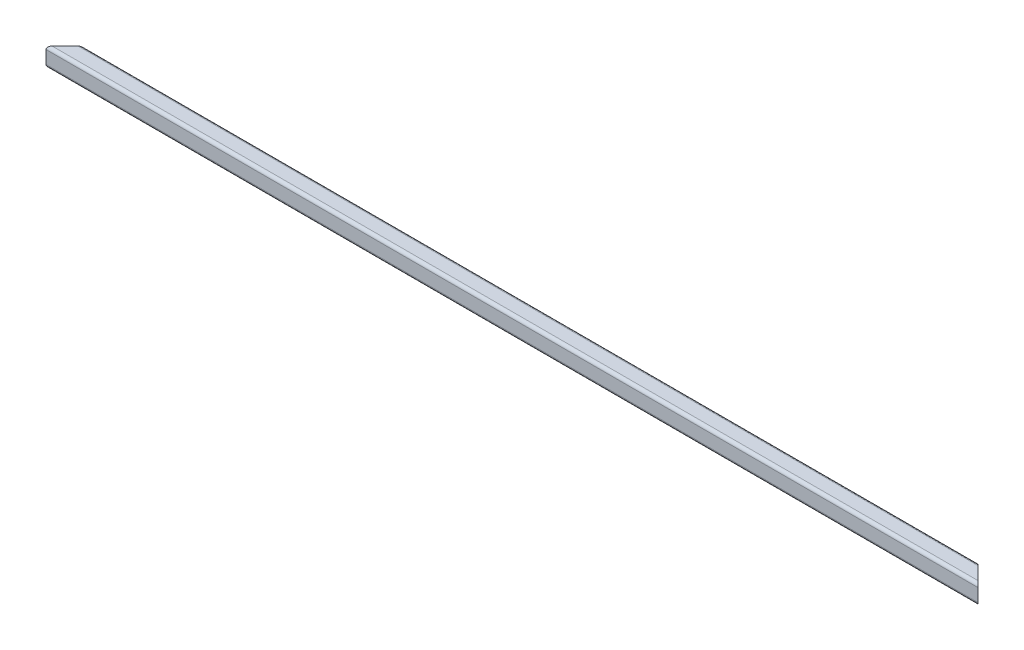
ISO-10303-21;
HEADER;
FILE_DESCRIPTION(('STEP AP214'),'2;1');
FILE_NAME('part.step','',(''),(''),'','','');
FILE_SCHEMA(('AUTOMOTIVE_DESIGN { 1 0 10303 214 1 1 1 1 }'));
ENDSEC;
DATA;
#1=APPLICATION_CONTEXT('core data for automotive mechanical design processes');
#2=APPLICATION_PROTOCOL_DEFINITION('international standard','automotive_design',2000,#1);
#3=PRODUCT_CONTEXT('',#1,'mechanical');
#4=PRODUCT('Part','Part','',(#3));
#5=PRODUCT_RELATED_PRODUCT_CATEGORY('part','',(#4));
#6=PRODUCT_DEFINITION_FORMATION('','',#4);
#7=PRODUCT_DEFINITION_CONTEXT('part definition',#1,'design');
#8=PRODUCT_DEFINITION('design','',#6,#7);
#9=PRODUCT_DEFINITION_SHAPE('','',#8);
#10=(LENGTH_UNIT() NAMED_UNIT(*) SI_UNIT(.MILLI.,.METRE.));
#11=(NAMED_UNIT(*) PLANE_ANGLE_UNIT() SI_UNIT($,.RADIAN.));
#12=(NAMED_UNIT(*) SI_UNIT($,.STERADIAN.) SOLID_ANGLE_UNIT());
#13=UNCERTAINTY_MEASURE_WITH_UNIT(LENGTH_MEASURE(1.E-05),#10,'distance_accuracy_value','');
#14=(GEOMETRIC_REPRESENTATION_CONTEXT(3) GLOBAL_UNCERTAINTY_ASSIGNED_CONTEXT((#13)) GLOBAL_UNIT_ASSIGNED_CONTEXT((#10,
#11,#12)) REPRESENTATION_CONTEXT('',''));
#15=CARTESIAN_POINT('',(0.,0.,0.));
#16=DIRECTION('',(0.,0.,1.));
#17=DIRECTION('',(1.,0.,0.));
#18=AXIS2_PLACEMENT_3D('',#15,#16,#17);
#19=CARTESIAN_POINT('',(1960.,13.6,-20.));
#20=DIRECTION('',(0.,0.,1.));
#21=DIRECTION('',(1.,0.,0.));
#22=AXIS2_PLACEMENT_3D('',#19,#20,#21);
#23=PLANE('',#22);
#24=DIRECTION('',(-1.,0.,0.));
#25=VECTOR('',#24,1.);
#26=CARTESIAN_POINT('',(1960.,-13.6,-20.));
#27=LINE('',#26,#25);
#28=CARTESIAN_POINT('',(1920.,-13.6,-20.0000000000004));
#29=VERTEX_POINT('',#28);
#30=CARTESIAN_POINT('',(40.,-13.6,-20.));
#31=VERTEX_POINT('',#30);
#32=EDGE_CURVE('E339',#29,#31,#27,.T.);
#33=ORIENTED_EDGE('',*,*,#32,.T.);
#34=DIRECTION('',(0.,1.,0.));
#35=VECTOR('',#34,1.);
#36=CARTESIAN_POINT('',(40.,-20.,-20.));
#37=LINE('',#36,#35);
#38=CARTESIAN_POINT('',(40.,13.6,-20.));
#39=VERTEX_POINT('',#38);
#40=EDGE_CURVE('E239',#31,#39,#37,.T.);
#41=ORIENTED_EDGE('',*,*,#40,.T.);
#42=DIRECTION('',(-1.,0.,0.));
#43=VECTOR('',#42,1.);
#44=CARTESIAN_POINT('',(1960.,13.6,-20.));
#45=LINE('',#44,#43);
#46=CARTESIAN_POINT('',(1920.,13.6,-20.0000000000004));
#47=VERTEX_POINT('',#46);
#48=EDGE_CURVE('E335',#47,#39,#45,.T.);
#49=ORIENTED_EDGE('',*,*,#48,.F.);
#50=DIRECTION('',(0.,1.,0.));
#51=VECTOR('',#50,1.);
#52=CARTESIAN_POINT('',(1920.,-20.,-20.0000000000004));
#53=LINE('',#52,#51);
#54=EDGE_CURVE('E236',#29,#47,#53,.T.);
#55=ORIENTED_EDGE('',*,*,#54,.F.);
#56=EDGE_LOOP('',(#33,#41,#49,#55));
#57=FACE_BOUND('',#56,.T.);
#58=ADVANCED_FACE('F69',(#57),#23,.F.);
#59=CARTESIAN_POINT('',(1960.,-13.6,-13.6));
#60=DIRECTION('',(-1.,0.,0.));
#61=DIRECTION('',(0.,0.,1.));
#62=AXIS2_PLACEMENT_3D('',#59,#60,#61);
#63=CYLINDRICAL_SURFACE('',#62,6.4);
#64=DIRECTION('',(-1.,0.,0.));
#65=VECTOR('',#64,1.);
#66=CARTESIAN_POINT('',(1960.,-20.,-13.6));
#67=LINE('',#66,#65);
#68=CARTESIAN_POINT('',(1926.4,-20.,-13.6));
#69=VERTEX_POINT('',#68);
#70=CARTESIAN_POINT('',(33.6000000000001,-20.,-13.6000000000001));
#71=VERTEX_POINT('',#70);
#72=EDGE_CURVE('E344',#69,#71,#67,.T.);
#73=ORIENTED_EDGE('',*,*,#72,.T.);
#74=CARTESIAN_POINT('',(33.6000000000001,-13.6,-13.6));
#75=DIRECTION('',(0.707106781186547,0.,0.707106781186548));
#76=DIRECTION('',(-0.707106781186548,0.,0.707106781186547));
#77=AXIS2_PLACEMENT_3D('',#74,#75,#76);
#78=ELLIPSE('',#77,9.05096679918782,6.4);
#79=EDGE_CURVE('E271',#71,#31,#78,.T.);
#80=ORIENTED_EDGE('',*,*,#79,.T.);
#81=ORIENTED_EDGE('',*,*,#32,.F.);
#82=CARTESIAN_POINT('',(1926.4,-13.6,-13.6));
#83=DIRECTION('',(-0.70710678118655,0.,0.707106781186545));
#84=DIRECTION('',(-0.707106781186545,0.,-0.70710678118655));
#85=AXIS2_PLACEMENT_3D('',#82,#83,#84);
#86=ELLIPSE('',#85,9.05096679918778,6.4);
#87=EDGE_CURVE('E313',#29,#69,#86,.T.);
#88=ORIENTED_EDGE('',*,*,#87,.T.);
#89=EDGE_LOOP('',(#73,#80,#81,#88));
#90=FACE_BOUND('',#89,.T.);
#91=ADVANCED_FACE('F432',(#90),#63,.T.);
#92=CARTESIAN_POINT('',(1960.,-20.,13.6));
#93=DIRECTION('',(0.,1.,0.));
#94=DIRECTION('',(0.,0.,1.));
#95=AXIS2_PLACEMENT_3D('',#92,#93,#94);
#96=PLANE('',#95);
#97=CARTESIAN_POINT('',(1460.,-20.,0.));
#98=DIRECTION('',(0.,1.,0.));
#99=DIRECTION('',(0.,0.,1.));
#100=AXIS2_PLACEMENT_3D('',#97,#98,#99);
#101=CIRCLE('',#100,2.0000000000001);
#102=CARTESIAN_POINT('',(1460.,-20.,2.00000000000009));
#103=VERTEX_POINT('',#102);
#104=EDGE_CURVE('E501',#103,#103,#101,.T.);
#105=ORIENTED_EDGE('',*,*,#104,.T.);
#106=EDGE_LOOP('',(#105));
#107=FACE_BOUND('',#106,.T.);
#108=CARTESIAN_POINT('',(980.,-20.,0.));
#109=DIRECTION('',(0.,1.,0.));
#110=DIRECTION('',(0.,0.,1.));
#111=AXIS2_PLACEMENT_3D('',#108,#109,#110);
#112=CIRCLE('',#111,2.);
#113=CARTESIAN_POINT('',(980.,-20.,1.99999999999998));
#114=VERTEX_POINT('',#113);
#115=EDGE_CURVE('E502',#114,#114,#112,.T.);
#116=ORIENTED_EDGE('',*,*,#115,.T.);
#117=EDGE_LOOP('',(#116));
#118=FACE_BOUND('',#117,.T.);
#119=CARTESIAN_POINT('',(500.,-20.,0.));
#120=DIRECTION('',(0.,1.,0.));
#121=DIRECTION('',(0.,0.,1.));
#122=AXIS2_PLACEMENT_3D('',#119,#120,#121);
#123=CIRCLE('',#122,2.);
#124=CARTESIAN_POINT('',(500.,-20.,1.99999999999998));
#125=VERTEX_POINT('',#124);
#126=EDGE_CURVE('E401',#125,#125,#123,.T.);
#127=ORIENTED_EDGE('',*,*,#126,.T.);
#128=EDGE_LOOP('',(#127));
#129=FACE_BOUND('',#128,.T.);
#130=DIRECTION('',(0.707106781186548,0.,-0.707106781186547));
#131=VECTOR('',#130,1.);
#132=CARTESIAN_POINT('',(40.,-20.,-20.));
#133=LINE('',#132,#131);
#134=CARTESIAN_POINT('',(6.39999999999995,-20.,13.6000000000001));
#135=VERTEX_POINT('',#134);
#136=CARTESIAN_POINT('',(18.5857864376269,-20.,1.41421356237308));
#137=VERTEX_POINT('',#136);
#138=EDGE_CURVE('E420',#135,#137,#133,.T.);
#139=ORIENTED_EDGE('',*,*,#138,.T.);
#140=CARTESIAN_POINT('',(20.,-20.,0.));
#141=DIRECTION('',(0.,1.,0.));
#142=DIRECTION('',(0.,0.,1.));
#143=AXIS2_PLACEMENT_3D('',#140,#141,#142);
#144=CIRCLE('',#143,2.);
#145=CARTESIAN_POINT('',(21.4142135623731,-20.,-1.41421356237311));
#146=VERTEX_POINT('',#145);
#147=EDGE_CURVE('E225',#137,#146,#144,.T.);
#148=ORIENTED_EDGE('',*,*,#147,.T.);
#149=EDGE_CURVE('E422',#146,#71,#133,.T.);
#150=ORIENTED_EDGE('',*,*,#149,.T.);
#151=ORIENTED_EDGE('',*,*,#72,.F.);
#152=DIRECTION('',(0.707106781186545,0.,0.70710678118655));
#153=VECTOR('',#152,1.);
#154=CARTESIAN_POINT('',(1920.,-20.,-20.0000000000004));
#155=LINE('',#154,#153);
#156=CARTESIAN_POINT('',(1938.58578643763,-20.,-1.41421356237316));
#157=VERTEX_POINT('',#156);
#158=EDGE_CURVE('E223',#69,#157,#155,.T.);
#159=ORIENTED_EDGE('',*,*,#158,.T.);
#160=CARTESIAN_POINT('',(1940.,-20.,0.));
#161=DIRECTION('',(0.,1.,0.));
#162=DIRECTION('',(0.,0.,1.));
#163=AXIS2_PLACEMENT_3D('',#160,#161,#162);
#164=CIRCLE('',#163,2.0000000000001);
#165=CARTESIAN_POINT('',(1941.41421356237,-20.,1.41421356237319));
#166=VERTEX_POINT('',#165);
#167=EDGE_CURVE('E209',#157,#166,#164,.T.);
#168=ORIENTED_EDGE('',*,*,#167,.T.);
#169=CARTESIAN_POINT('',(1953.6,-20.,13.6));
#170=VERTEX_POINT('',#169);
#171=EDGE_CURVE('E220',#166,#170,#155,.T.);
#172=ORIENTED_EDGE('',*,*,#171,.T.);
#173=DIRECTION('',(-1.,0.,0.));
#174=VECTOR('',#173,1.);
#175=CARTESIAN_POINT('',(1960.,-20.,13.6));
#176=LINE('',#175,#174);
#177=EDGE_CURVE('E348',#170,#135,#176,.T.);
#178=ORIENTED_EDGE('',*,*,#177,.T.);
#179=EDGE_LOOP('',(#139,#148,#150,#151,#159,#168,#172,#178));
#180=FACE_BOUND('',#179,.T.);
#181=ADVANCED_FACE('F218',(#107,#118,#129,#180),#96,.F.);
#182=CARTESIAN_POINT('',(1960.,-13.6,20.));
#183=DIRECTION('',(0.,0.,-1.));
#184=DIRECTION('',(0.,1.,0.));
#185=AXIS2_PLACEMENT_3D('',#182,#183,#184);
#186=PLANE('',#185);
#187=DIRECTION('',(0.,-1.,0.));
#188=VECTOR('',#187,1.);
#189=CARTESIAN_POINT('',(0.,-13.6,20.));
#190=LINE('',#189,#188);
#191=CARTESIAN_POINT('',(0.,13.6,20.));
#192=VERTEX_POINT('',#191);
#193=CARTESIAN_POINT('',(0.,-13.6,20.));
#194=VERTEX_POINT('',#193);
#195=EDGE_CURVE('E327',#192,#194,#190,.T.);
#196=ORIENTED_EDGE('',*,*,#195,.T.);
#197=DIRECTION('',(-1.,0.,0.));
#198=VECTOR('',#197,1.);
#199=CARTESIAN_POINT('',(1960.,-13.6,20.));
#200=LINE('',#199,#198);
#201=CARTESIAN_POINT('',(1960.,-13.6,20.));
#202=VERTEX_POINT('',#201);
#203=EDGE_CURVE('E351',#202,#194,#200,.T.);
#204=ORIENTED_EDGE('',*,*,#203,.F.);
#205=DIRECTION('',(0.,-1.,0.));
#206=VECTOR('',#205,1.);
#207=CARTESIAN_POINT('',(1960.,-13.6,20.));
#208=LINE('',#207,#206);
#209=CARTESIAN_POINT('',(1960.,13.6,20.));
#210=VERTEX_POINT('',#209);
#211=EDGE_CURVE('E328',#210,#202,#208,.T.);
#212=ORIENTED_EDGE('',*,*,#211,.F.);
#213=DIRECTION('',(-1.,0.,0.));
#214=VECTOR('',#213,1.);
#215=CARTESIAN_POINT('',(1960.,13.6,20.));
#216=LINE('',#215,#214);
#217=EDGE_CURVE('E355',#210,#192,#216,.T.);
#218=ORIENTED_EDGE('',*,*,#217,.T.);
#219=EDGE_LOOP('',(#196,#204,#212,#218));
#220=FACE_BOUND('',#219,.T.);
#221=ADVANCED_FACE('F451',(#220),#186,.F.);
#222=CARTESIAN_POINT('',(1960.,-13.6,13.6));
#223=DIRECTION('',(-1.,0.,0.));
#224=DIRECTION('',(0.,0.,1.));
#225=AXIS2_PLACEMENT_3D('',#222,#223,#224);
#226=CYLINDRICAL_SURFACE('',#225,6.4);
#227=ORIENTED_EDGE('',*,*,#203,.T.);
#228=CARTESIAN_POINT('',(6.39999999999996,-13.6,13.6));
#229=DIRECTION('',(0.707106781186547,0.,0.707106781186548));
#230=DIRECTION('',(-0.707106781186548,0.,0.707106781186547));
#231=AXIS2_PLACEMENT_3D('',#228,#229,#230);
#232=ELLIPSE('',#231,9.05096679918781,6.4);
#233=EDGE_CURVE('E275',#194,#135,#232,.T.);
#234=ORIENTED_EDGE('',*,*,#233,.T.);
#235=ORIENTED_EDGE('',*,*,#177,.F.);
#236=CARTESIAN_POINT('',(1953.6,-13.6,13.6));
#237=DIRECTION('',(-0.70710678118655,0.,0.707106781186545));
#238=DIRECTION('',(-0.707106781186545,0.,-0.70710678118655));
#239=AXIS2_PLACEMENT_3D('',#236,#237,#238);
#240=ELLIPSE('',#239,9.05096679918777,6.4);
#241=EDGE_CURVE('E229',#170,#202,#240,.T.);
#242=ORIENTED_EDGE('',*,*,#241,.T.);
#243=EDGE_LOOP('',(#227,#234,#235,#242));
#244=FACE_BOUND('',#243,.T.);
#245=ADVANCED_FACE('F450',(#244),#226,.T.);
#246=CARTESIAN_POINT('',(1960.,13.6,13.6));
#247=DIRECTION('',(-1.,0.,0.));
#248=DIRECTION('',(0.,0.,1.));
#249=AXIS2_PLACEMENT_3D('',#246,#247,#248);
#250=CYLINDRICAL_SURFACE('',#249,6.4);
#251=DIRECTION('',(-1.,0.,0.));
#252=VECTOR('',#251,1.);
#253=CARTESIAN_POINT('',(1960.,20.,13.6));
#254=LINE('',#253,#252);
#255=CARTESIAN_POINT('',(1953.6,20.,13.6));
#256=VERTEX_POINT('',#255);
#257=CARTESIAN_POINT('',(6.39999999999998,20.,13.6));
#258=VERTEX_POINT('',#257);
#259=EDGE_CURVE('E359',#256,#258,#254,.T.);
#260=ORIENTED_EDGE('',*,*,#259,.T.);
#261=CARTESIAN_POINT('',(6.39999999999996,13.6,13.6));
#262=DIRECTION('',(0.707106781186547,0.,0.707106781186548));
#263=DIRECTION('',(-0.707106781186548,0.,0.707106781186547));
#264=AXIS2_PLACEMENT_3D('',#261,#262,#263);
#265=ELLIPSE('',#264,9.05096679918782,6.4);
#266=EDGE_CURVE('E279',#258,#192,#265,.T.);
#267=ORIENTED_EDGE('',*,*,#266,.T.);
#268=ORIENTED_EDGE('',*,*,#217,.F.);
#269=CARTESIAN_POINT('',(1953.6,13.6,13.6));
#270=DIRECTION('',(-0.70710678118655,0.,0.707106781186545));
#271=DIRECTION('',(-0.707106781186545,0.,-0.70710678118655));
#272=AXIS2_PLACEMENT_3D('',#269,#270,#271);
#273=ELLIPSE('',#272,9.05096679918778,6.4);
#274=EDGE_CURVE('E319',#210,#256,#273,.T.);
#275=ORIENTED_EDGE('',*,*,#274,.T.);
#276=EDGE_LOOP('',(#260,#267,#268,#275));
#277=FACE_BOUND('',#276,.T.);
#278=ADVANCED_FACE('F444',(#277),#250,.T.);
#279=CARTESIAN_POINT('',(1960.,20.,-13.6));
#280=DIRECTION('',(0.,-1.,0.));
#281=DIRECTION('',(0.,0.,-1.));
#282=AXIS2_PLACEMENT_3D('',#279,#280,#281);
#283=PLANE('',#282);
#284=DIRECTION('',(-1.,0.,0.));
#285=VECTOR('',#284,1.);
#286=CARTESIAN_POINT('',(1960.,20.,-13.6));
#287=LINE('',#286,#285);
#288=CARTESIAN_POINT('',(1926.4,20.,-13.6));
#289=VERTEX_POINT('',#288);
#290=CARTESIAN_POINT('',(33.5999999999999,20.,-13.5999999999998));
#291=VERTEX_POINT('',#290);
#292=EDGE_CURVE('E363',#289,#291,#287,.T.);
#293=ORIENTED_EDGE('',*,*,#292,.T.);
#294=DIRECTION('',(0.707106781186548,0.,-0.707106781186547));
#295=VECTOR('',#294,1.);
#296=CARTESIAN_POINT('',(40.,20.,-20.));
#297=LINE('',#296,#295);
#298=EDGE_CURVE('E244',#258,#291,#297,.T.);
#299=ORIENTED_EDGE('',*,*,#298,.F.);
#300=ORIENTED_EDGE('',*,*,#259,.F.);
#301=DIRECTION('',(0.707106781186545,0.,0.70710678118655));
#302=VECTOR('',#301,1.);
#303=CARTESIAN_POINT('',(1920.,20.,-20.0000000000004));
#304=LINE('',#303,#302);
#305=EDGE_CURVE('E232',#289,#256,#304,.T.);
#306=ORIENTED_EDGE('',*,*,#305,.F.);
#307=EDGE_LOOP('',(#293,#299,#300,#306));
#308=FACE_BOUND('',#307,.T.);
#309=ADVANCED_FACE('F442',(#308),#283,.F.);
#310=CARTESIAN_POINT('',(1960.,13.6,-13.6));
#311=DIRECTION('',(-1.,0.,0.));
#312=DIRECTION('',(0.,0.,1.));
#313=AXIS2_PLACEMENT_3D('',#310,#311,#312);
#314=CYLINDRICAL_SURFACE('',#313,6.4);
#315=ORIENTED_EDGE('',*,*,#48,.T.);
#316=CARTESIAN_POINT('',(33.6000000000001,13.6,-13.6));
#317=DIRECTION('',(0.707106781186547,0.,0.707106781186548));
#318=DIRECTION('',(-0.707106781186548,0.,0.707106781186547));
#319=AXIS2_PLACEMENT_3D('',#316,#317,#318);
#320=ELLIPSE('',#319,9.05096679918782,6.4);
#321=EDGE_CURVE('E283',#39,#291,#320,.T.);
#322=ORIENTED_EDGE('',*,*,#321,.T.);
#323=ORIENTED_EDGE('',*,*,#292,.F.);
#324=CARTESIAN_POINT('',(1926.4,13.6,-13.6));
#325=DIRECTION('',(-0.70710678118655,0.,0.707106781186545));
#326=DIRECTION('',(-0.707106781186545,0.,-0.70710678118655));
#327=AXIS2_PLACEMENT_3D('',#324,#325,#326);
#328=ELLIPSE('',#327,9.05096679918778,6.4);
#329=EDGE_CURVE('E323',#289,#47,#328,.T.);
#330=ORIENTED_EDGE('',*,*,#329,.T.);
#331=EDGE_LOOP('',(#315,#322,#323,#330));
#332=FACE_BOUND('',#331,.T.);
#333=ADVANCED_FACE('F437',(#332),#314,.T.);
#334=CARTESIAN_POINT('',(40.,-20.,-20.));
#335=DIRECTION('',(0.707106781186547,0.,0.707106781186548));
#336=DIRECTION('',(0.707106781186548,0.,-0.707106781186547));
#337=AXIS2_PLACEMENT_3D('',#334,#335,#336);
#338=PLANE('',#337);
#339=ORIENTED_EDGE('',*,*,#149,.F.);
#340=DIRECTION('',(0.,1.,0.));
#341=VECTOR('',#340,1.);
#342=CARTESIAN_POINT('',(21.4142135623731,-20.,-1.41421356237311));
#343=LINE('',#342,#341);
#344=CARTESIAN_POINT('',(21.4142135623729,-16.8,-1.41421356237334));
#345=VERTEX_POINT('',#344);
#346=EDGE_CURVE('E406',#146,#345,#343,.T.);
#347=ORIENTED_EDGE('',*,*,#346,.T.);
#348=DIRECTION('',(0.707106781186548,0.,-0.707106781186547));
#349=VECTOR('',#348,1.);
#350=CARTESIAN_POINT('',(983.2,-16.8000000000001,-963.2));
#351=LINE('',#350,#349);
#352=CARTESIAN_POINT('',(33.5999999999995,-16.8,-13.5999999999998));
#353=VERTEX_POINT('',#352);
#354=EDGE_CURVE('E251',#345,#353,#351,.T.);
#355=ORIENTED_EDGE('',*,*,#354,.T.);
#356=CARTESIAN_POINT('',(33.6000000000001,-13.6,-13.6));
#357=DIRECTION('',(0.707106781186547,0.,0.707106781186548));
#358=DIRECTION('',(-0.707106781186548,0.,0.707106781186547));
#359=AXIS2_PLACEMENT_3D('',#356,#357,#358);
#360=ELLIPSE('',#359,4.5254833995939,3.2);
#361=CARTESIAN_POINT('',(36.8000000000002,-13.6,-16.8));
#362=VERTEX_POINT('',#361);
#363=EDGE_CURVE('E256',#353,#362,#360,.T.);
#364=ORIENTED_EDGE('',*,*,#363,.T.);
#365=DIRECTION('',(0.,1.,0.));
#366=VECTOR('',#365,1.);
#367=CARTESIAN_POINT('',(36.8000000000002,13.6000000000002,-16.8));
#368=LINE('',#367,#366);
#369=CARTESIAN_POINT('',(36.8000000000002,13.6,-16.8));
#370=VERTEX_POINT('',#369);
#371=EDGE_CURVE('E259',#362,#370,#368,.T.);
#372=ORIENTED_EDGE('',*,*,#371,.T.);
#373=CARTESIAN_POINT('',(33.6000000000001,13.6,-13.6));
#374=DIRECTION('',(0.707106781186547,0.,0.707106781186548));
#375=DIRECTION('',(-0.707106781186548,0.,0.707106781186547));
#376=AXIS2_PLACEMENT_3D('',#373,#374,#375);
#377=ELLIPSE('',#376,4.5254833995939,3.2);
#378=CARTESIAN_POINT('',(33.6000000000001,16.8,-13.6));
#379=VERTEX_POINT('',#378);
#380=EDGE_CURVE('E262',#370,#379,#377,.T.);
#381=ORIENTED_EDGE('',*,*,#380,.T.);
#382=DIRECTION('',(-0.707106781186548,0.,0.707106781186547));
#383=VECTOR('',#382,1.);
#384=CARTESIAN_POINT('',(996.8,16.8000000000001,-976.8));
#385=LINE('',#384,#383);
#386=CARTESIAN_POINT('',(6.39999999999963,16.8,13.5999999999999));
#387=VERTEX_POINT('',#386);
#388=EDGE_CURVE('E265',#379,#387,#385,.T.);
#389=ORIENTED_EDGE('',*,*,#388,.T.);
#390=CARTESIAN_POINT('',(6.39999999999996,13.6,13.6));
#391=DIRECTION('',(0.707106781186547,0.,0.707106781186548));
#392=DIRECTION('',(-0.707106781186548,0.,0.707106781186547));
#393=AXIS2_PLACEMENT_3D('',#390,#391,#392);
#394=ELLIPSE('',#393,4.52548339959391,3.2);
#395=CARTESIAN_POINT('',(3.20000000000009,13.6,16.8));
#396=VERTEX_POINT('',#395);
#397=EDGE_CURVE('E268',#387,#396,#394,.T.);
#398=ORIENTED_EDGE('',*,*,#397,.T.);
#399=DIRECTION('',(0.,-1.,0.));
#400=VECTOR('',#399,1.);
#401=CARTESIAN_POINT('',(3.20000000000009,-13.6000000000003,16.8));
#402=LINE('',#401,#400);
#403=CARTESIAN_POINT('',(3.20000000000009,-13.6,16.8));
#404=VERTEX_POINT('',#403);
#405=EDGE_CURVE('E245',#396,#404,#402,.T.);
#406=ORIENTED_EDGE('',*,*,#405,.T.);
#407=CARTESIAN_POINT('',(6.39999999999996,-13.6,13.6));
#408=DIRECTION('',(0.707106781186547,0.,0.707106781186548));
#409=DIRECTION('',(-0.707106781186548,0.,0.707106781186547));
#410=AXIS2_PLACEMENT_3D('',#407,#408,#409);
#411=ELLIPSE('',#410,4.5254833995939,3.2);
#412=CARTESIAN_POINT('',(6.39999999999996,-16.8,13.6));
#413=VERTEX_POINT('',#412);
#414=EDGE_CURVE('E248',#404,#413,#411,.T.);
#415=ORIENTED_EDGE('',*,*,#414,.T.);
#416=CARTESIAN_POINT('',(18.5857864376267,-16.8,1.41421356237285));
#417=VERTEX_POINT('',#416);
#418=EDGE_CURVE('E252',#413,#417,#351,.T.);
#419=ORIENTED_EDGE('',*,*,#418,.T.);
#420=DIRECTION('',(0.,1.,0.));
#421=VECTOR('',#420,1.);
#422=CARTESIAN_POINT('',(18.5857864376269,-20.,1.41421356237308));
#423=LINE('',#422,#421);
#424=EDGE_CURVE('E94',#417,#137,#423,.F.);
#425=ORIENTED_EDGE('',*,*,#424,.T.);
#426=ORIENTED_EDGE('',*,*,#138,.F.);
#427=ORIENTED_EDGE('',*,*,#233,.F.);
#428=ORIENTED_EDGE('',*,*,#195,.F.);
#429=ORIENTED_EDGE('',*,*,#266,.F.);
#430=ORIENTED_EDGE('',*,*,#298,.T.);
#431=ORIENTED_EDGE('',*,*,#321,.F.);
#432=ORIENTED_EDGE('',*,*,#40,.F.);
#433=ORIENTED_EDGE('',*,*,#79,.F.);
#434=EDGE_LOOP('',(#339,#347,#355,#364,#372,#381,#389,#398,#406,#415,#419,#425,#426,#427,#428,
#429,#430,#431,#432,#433));
#435=FACE_BOUND('',#434,.T.);
#436=ADVANCED_FACE('F428',(#435),#338,.F.);
#437=CARTESIAN_POINT('',(1920.,-20.,-20.0000000000004));
#438=DIRECTION('',(-0.70710678118655,0.,0.707106781186545));
#439=DIRECTION('',(0.707106781186545,0.,0.70710678118655));
#440=AXIS2_PLACEMENT_3D('',#437,#438,#439);
#441=PLANE('',#440);
#442=ORIENTED_EDGE('',*,*,#171,.F.);
#443=DIRECTION('',(0.,1.,0.));
#444=VECTOR('',#443,1.);
#445=CARTESIAN_POINT('',(1941.41421356237,-20.,1.41421356237319));
#446=LINE('',#445,#444);
#447=CARTESIAN_POINT('',(1941.41421356237,-16.8,1.41421356237324));
#448=VERTEX_POINT('',#447);
#449=EDGE_CURVE('E206',#166,#448,#446,.T.);
#450=ORIENTED_EDGE('',*,*,#449,.T.);
#451=DIRECTION('',(0.707106781186545,0.,0.70710678118655));
#452=VECTOR('',#451,1.);
#453=CARTESIAN_POINT('',(1956.8,-16.8,16.8));
#454=LINE('',#453,#452);
#455=CARTESIAN_POINT('',(1953.6,-16.8,13.6));
#456=VERTEX_POINT('',#455);
#457=EDGE_CURVE('E293',#448,#456,#454,.T.);
#458=ORIENTED_EDGE('',*,*,#457,.T.);
#459=CARTESIAN_POINT('',(1953.6,-13.6,13.6));
#460=DIRECTION('',(-0.70710678118655,0.,0.707106781186545));
#461=DIRECTION('',(-0.707106781186545,0.,-0.70710678118655));
#462=AXIS2_PLACEMENT_3D('',#459,#460,#461);
#463=ELLIPSE('',#462,4.52548339959388,3.2);
#464=CARTESIAN_POINT('',(1956.8,-13.6,16.8));
#465=VERTEX_POINT('',#464);
#466=EDGE_CURVE('E290',#456,#465,#463,.T.);
#467=ORIENTED_EDGE('',*,*,#466,.T.);
#468=DIRECTION('',(0.,1.,0.));
#469=VECTOR('',#468,1.);
#470=CARTESIAN_POINT('',(1956.8,-13.6,16.8));
#471=LINE('',#470,#469);
#472=CARTESIAN_POINT('',(1956.8,13.6,16.8));
#473=VERTEX_POINT('',#472);
#474=EDGE_CURVE('E287',#465,#473,#471,.T.);
#475=ORIENTED_EDGE('',*,*,#474,.T.);
#476=CARTESIAN_POINT('',(1953.6,13.6,13.6));
#477=DIRECTION('',(-0.70710678118655,0.,0.707106781186545));
#478=DIRECTION('',(-0.707106781186545,0.,-0.70710678118655));
#479=AXIS2_PLACEMENT_3D('',#476,#477,#478);
#480=ELLIPSE('',#479,4.52548339959389,3.2);
#481=CARTESIAN_POINT('',(1953.6,16.8,13.6));
#482=VERTEX_POINT('',#481);
#483=EDGE_CURVE('E310',#473,#482,#480,.T.);
#484=ORIENTED_EDGE('',*,*,#483,.T.);
#485=DIRECTION('',(-0.707106781186545,0.,-0.70710678118655));
#486=VECTOR('',#485,1.);
#487=CARTESIAN_POINT('',(1943.2,16.8,3.19999999999987));
#488=LINE('',#487,#486);
#489=CARTESIAN_POINT('',(1926.4,16.8,-13.6));
#490=VERTEX_POINT('',#489);
#491=EDGE_CURVE('E307',#482,#490,#488,.T.);
#492=ORIENTED_EDGE('',*,*,#491,.T.);
#493=CARTESIAN_POINT('',(1926.4,13.6,-13.6));
#494=DIRECTION('',(-0.70710678118655,0.,0.707106781186545));
#495=DIRECTION('',(-0.707106781186545,0.,-0.70710678118655));
#496=AXIS2_PLACEMENT_3D('',#493,#494,#495);
#497=ELLIPSE('',#496,4.52548339959389,3.2);
#498=CARTESIAN_POINT('',(1923.2,13.6,-16.8));
#499=VERTEX_POINT('',#498);
#500=EDGE_CURVE('E304',#490,#499,#497,.T.);
#501=ORIENTED_EDGE('',*,*,#500,.T.);
#502=DIRECTION('',(0.,-1.,0.));
#503=VECTOR('',#502,1.);
#504=CARTESIAN_POINT('',(1923.2,13.6,-16.8));
#505=LINE('',#504,#503);
#506=CARTESIAN_POINT('',(1923.2,-13.6,-16.8));
#507=VERTEX_POINT('',#506);
#508=EDGE_CURVE('E301',#499,#507,#505,.T.);
#509=ORIENTED_EDGE('',*,*,#508,.T.);
#510=CARTESIAN_POINT('',(1926.4,-13.6,-13.6));
#511=DIRECTION('',(-0.70710678118655,0.,0.707106781186545));
#512=DIRECTION('',(-0.707106781186545,0.,-0.70710678118655));
#513=AXIS2_PLACEMENT_3D('',#510,#511,#512);
#514=ELLIPSE('',#513,4.52548339959389,3.2);
#515=CARTESIAN_POINT('',(1926.4,-16.8,-13.6));
#516=VERTEX_POINT('',#515);
#517=EDGE_CURVE('E298',#507,#516,#514,.T.);
#518=ORIENTED_EDGE('',*,*,#517,.T.);
#519=CARTESIAN_POINT('',(1938.58578643763,-16.8,-1.41421356237311));
#520=VERTEX_POINT('',#519);
#521=EDGE_CURVE('E294',#516,#520,#454,.T.);
#522=ORIENTED_EDGE('',*,*,#521,.T.);
#523=DIRECTION('',(0.,1.,0.));
#524=VECTOR('',#523,1.);
#525=CARTESIAN_POINT('',(1938.58578643763,-20.,-1.41421356237316));
#526=LINE('',#525,#524);
#527=EDGE_CURVE('E87',#520,#157,#526,.F.);
#528=ORIENTED_EDGE('',*,*,#527,.T.);
#529=ORIENTED_EDGE('',*,*,#158,.F.);
#530=ORIENTED_EDGE('',*,*,#87,.F.);
#531=ORIENTED_EDGE('',*,*,#54,.T.);
#532=ORIENTED_EDGE('',*,*,#329,.F.);
#533=ORIENTED_EDGE('',*,*,#305,.T.);
#534=ORIENTED_EDGE('',*,*,#274,.F.);
#535=ORIENTED_EDGE('',*,*,#211,.T.);
#536=ORIENTED_EDGE('',*,*,#241,.F.);
#537=EDGE_LOOP('',(#442,#450,#458,#467,#475,#484,#492,#501,#509,#518,#522,#528,#529,#530,#531,
#532,#533,#534,#535,#536));
#538=FACE_BOUND('',#537,.T.);
#539=ADVANCED_FACE('F227',(#538),#441,.F.);
#540=CARTESIAN_POINT('',(1960.,13.6,13.6));
#541=DIRECTION('',(-1.,0.,0.));
#542=DIRECTION('',(0.,0.,1.));
#543=AXIS2_PLACEMENT_3D('',#540,#541,#542);
#544=CYLINDRICAL_SURFACE('',#543,3.2);
#545=ORIENTED_EDGE('',*,*,#397,.F.);
#546=DIRECTION('',(-1.,0.,0.));
#547=VECTOR('',#546,1.);
#548=CARTESIAN_POINT('',(1960.,16.8,13.6));
#549=LINE('',#548,#547);
#550=EDGE_CURVE('E340',#482,#387,#549,.T.);
#551=ORIENTED_EDGE('',*,*,#550,.F.);
#552=ORIENTED_EDGE('',*,*,#483,.F.);
#553=DIRECTION('',(-1.,0.,0.));
#554=VECTOR('',#553,1.);
#555=CARTESIAN_POINT('',(1960.,13.6,16.8));
#556=LINE('',#555,#554);
#557=EDGE_CURVE('E331',#473,#396,#556,.T.);
#558=ORIENTED_EDGE('',*,*,#557,.T.);
#559=EDGE_LOOP('',(#545,#551,#552,#558));
#560=FACE_BOUND('',#559,.T.);
#561=ADVANCED_FACE('F71',(#560),#544,.F.);
#562=CARTESIAN_POINT('',(1960.,16.8,-13.6));
#563=DIRECTION('',(0.,-1.,0.));
#564=DIRECTION('',(0.,0.,-1.));
#565=AXIS2_PLACEMENT_3D('',#562,#563,#564);
#566=PLANE('',#565);
#567=ORIENTED_EDGE('',*,*,#388,.F.);
#568=DIRECTION('',(-1.,0.,0.));
#569=VECTOR('',#568,1.);
#570=CARTESIAN_POINT('',(1960.,16.8,-13.6));
#571=LINE('',#570,#569);
#572=EDGE_CURVE('E390',#490,#379,#571,.T.);
#573=ORIENTED_EDGE('',*,*,#572,.F.);
#574=ORIENTED_EDGE('',*,*,#491,.F.);
#575=ORIENTED_EDGE('',*,*,#550,.T.);
#576=EDGE_LOOP('',(#567,#573,#574,#575));
#577=FACE_BOUND('',#576,.T.);
#578=ADVANCED_FACE('F476',(#577),#566,.T.);
#579=CARTESIAN_POINT('',(1960.,13.6,-13.6));
#580=DIRECTION('',(-1.,0.,0.));
#581=DIRECTION('',(0.,0.,1.));
#582=AXIS2_PLACEMENT_3D('',#579,#580,#581);
#583=CYLINDRICAL_SURFACE('',#582,3.2);
#584=ORIENTED_EDGE('',*,*,#380,.F.);
#585=DIRECTION('',(-1.,0.,0.));
#586=VECTOR('',#585,1.);
#587=CARTESIAN_POINT('',(1960.,13.6,-16.8));
#588=LINE('',#587,#586);
#589=EDGE_CURVE('E386',#499,#370,#588,.T.);
#590=ORIENTED_EDGE('',*,*,#589,.F.);
#591=ORIENTED_EDGE('',*,*,#500,.F.);
#592=ORIENTED_EDGE('',*,*,#572,.T.);
#593=EDGE_LOOP('',(#584,#590,#591,#592));
#594=FACE_BOUND('',#593,.T.);
#595=ADVANCED_FACE('F479',(#594),#583,.F.);
#596=CARTESIAN_POINT('',(1960.,13.6,-16.8));
#597=DIRECTION('',(0.,0.,1.));
#598=DIRECTION('',(1.,0.,0.));
#599=AXIS2_PLACEMENT_3D('',#596,#597,#598);
#600=PLANE('',#599);
#601=ORIENTED_EDGE('',*,*,#371,.F.);
#602=DIRECTION('',(-1.,0.,0.));
#603=VECTOR('',#602,1.);
#604=CARTESIAN_POINT('',(1960.,-13.6,-16.8));
#605=LINE('',#604,#603);
#606=EDGE_CURVE('E382',#507,#362,#605,.T.);
#607=ORIENTED_EDGE('',*,*,#606,.F.);
#608=ORIENTED_EDGE('',*,*,#508,.F.);
#609=ORIENTED_EDGE('',*,*,#589,.T.);
#610=EDGE_LOOP('',(#601,#607,#608,#609));
#611=FACE_BOUND('',#610,.T.);
#612=ADVANCED_FACE('F486',(#611),#600,.T.);
#613=CARTESIAN_POINT('',(1960.,-13.6,-13.6));
#614=DIRECTION('',(-1.,0.,0.));
#615=DIRECTION('',(0.,0.,1.));
#616=AXIS2_PLACEMENT_3D('',#613,#614,#615);
#617=CYLINDRICAL_SURFACE('',#616,3.2);
#618=ORIENTED_EDGE('',*,*,#363,.F.);
#619=DIRECTION('',(-1.,0.,0.));
#620=VECTOR('',#619,1.);
#621=CARTESIAN_POINT('',(1960.,-16.8,-13.6));
#622=LINE('',#621,#620);
#623=EDGE_CURVE('E378',#516,#353,#622,.T.);
#624=ORIENTED_EDGE('',*,*,#623,.F.);
#625=ORIENTED_EDGE('',*,*,#517,.F.);
#626=ORIENTED_EDGE('',*,*,#606,.T.);
#627=EDGE_LOOP('',(#618,#624,#625,#626));
#628=FACE_BOUND('',#627,.T.);
#629=ADVANCED_FACE('F489',(#628),#617,.F.);
#630=CARTESIAN_POINT('',(1960.,-16.8,13.6));
#631=DIRECTION('',(0.,1.,0.));
#632=DIRECTION('',(0.,0.,1.));
#633=AXIS2_PLACEMENT_3D('',#630,#631,#632);
#634=PLANE('',#633);
#635=CARTESIAN_POINT('',(1460.,-16.8,0.));
#636=DIRECTION('',(0.,1.,0.));
#637=DIRECTION('',(0.,0.,1.));
#638=AXIS2_PLACEMENT_3D('',#635,#636,#637);
#639=CIRCLE('',#638,2.0000000000001);
#640=CARTESIAN_POINT('',(1460.,-16.8,2.00000000000009));
#641=VERTEX_POINT('',#640);
#642=EDGE_CURVE('E73',#641,#641,#639,.T.);
#643=ORIENTED_EDGE('',*,*,#642,.F.);
#644=EDGE_LOOP('',(#643));
#645=FACE_BOUND('',#644,.T.);
#646=CARTESIAN_POINT('',(980.,-16.8,0.));
#647=DIRECTION('',(0.,1.,0.));
#648=DIRECTION('',(0.,0.,1.));
#649=AXIS2_PLACEMENT_3D('',#646,#647,#648);
#650=CIRCLE('',#649,2.);
#651=CARTESIAN_POINT('',(980.,-16.8,1.99999999999998));
#652=VERTEX_POINT('',#651);
#653=EDGE_CURVE('E403',#652,#652,#650,.T.);
#654=ORIENTED_EDGE('',*,*,#653,.F.);
#655=EDGE_LOOP('',(#654));
#656=FACE_BOUND('',#655,.T.);
#657=CARTESIAN_POINT('',(20.,-16.8,0.));
#658=DIRECTION('',(0.,1.,0.));
#659=DIRECTION('',(0.,0.,1.));
#660=AXIS2_PLACEMENT_3D('',#657,#658,#659);
#661=CIRCLE('',#660,2.);
#662=EDGE_CURVE('E12',#417,#345,#661,.T.);
#663=ORIENTED_EDGE('',*,*,#662,.F.);
#664=ORIENTED_EDGE('',*,*,#418,.F.);
#665=DIRECTION('',(-1.,0.,0.));
#666=VECTOR('',#665,1.);
#667=CARTESIAN_POINT('',(1960.,-16.8,13.6));
#668=LINE('',#667,#666);
#669=EDGE_CURVE('E374',#456,#413,#668,.T.);
#670=ORIENTED_EDGE('',*,*,#669,.F.);
#671=ORIENTED_EDGE('',*,*,#457,.F.);
#672=CARTESIAN_POINT('',(1940.,-16.8,0.));
#673=DIRECTION('',(0.,1.,0.));
#674=DIRECTION('',(0.,0.,1.));
#675=AXIS2_PLACEMENT_3D('',#672,#673,#674);
#676=CIRCLE('',#675,2.0000000000001);
#677=EDGE_CURVE('E79',#520,#448,#676,.T.);
#678=ORIENTED_EDGE('',*,*,#677,.F.);
#679=ORIENTED_EDGE('',*,*,#521,.F.);
#680=ORIENTED_EDGE('',*,*,#623,.T.);
#681=ORIENTED_EDGE('',*,*,#354,.F.);
#682=EDGE_LOOP('',(#663,#664,#670,#671,#678,#679,#680,#681));
#683=FACE_BOUND('',#682,.T.);
#684=CARTESIAN_POINT('',(500.,-16.8,0.));
#685=DIRECTION('',(0.,1.,0.));
#686=DIRECTION('',(0.,0.,1.));
#687=AXIS2_PLACEMENT_3D('',#684,#685,#686);
#688=CIRCLE('',#687,2.);
#689=CARTESIAN_POINT('',(500.,-16.8,1.99999999999998));
#690=VERTEX_POINT('',#689);
#691=EDGE_CURVE('E397',#690,#690,#688,.T.);
#692=ORIENTED_EDGE('',*,*,#691,.F.);
#693=EDGE_LOOP('',(#692));
#694=FACE_BOUND('',#693,.T.);
#695=ADVANCED_FACE('F456',(#645,#656,#683,#694),#634,.T.);
#696=CARTESIAN_POINT('',(1960.,-13.6,13.6));
#697=DIRECTION('',(-1.,0.,0.));
#698=DIRECTION('',(0.,0.,1.));
#699=AXIS2_PLACEMENT_3D('',#696,#697,#698);
#700=CYLINDRICAL_SURFACE('',#699,3.2);
#701=ORIENTED_EDGE('',*,*,#414,.F.);
#702=DIRECTION('',(-1.,0.,0.));
#703=VECTOR('',#702,1.);
#704=CARTESIAN_POINT('',(1960.,-13.6,16.8));
#705=LINE('',#704,#703);
#706=EDGE_CURVE('E370',#465,#404,#705,.T.);
#707=ORIENTED_EDGE('',*,*,#706,.F.);
#708=ORIENTED_EDGE('',*,*,#466,.F.);
#709=ORIENTED_EDGE('',*,*,#669,.T.);
#710=EDGE_LOOP('',(#701,#707,#708,#709));
#711=FACE_BOUND('',#710,.T.);
#712=ADVANCED_FACE('F460',(#711),#700,.F.);
#713=CARTESIAN_POINT('',(1960.,-13.6,16.8));
#714=DIRECTION('',(0.,0.,-1.));
#715=DIRECTION('',(0.,1.,0.));
#716=AXIS2_PLACEMENT_3D('',#713,#714,#715);
#717=PLANE('',#716);
#718=ORIENTED_EDGE('',*,*,#405,.F.);
#719=ORIENTED_EDGE('',*,*,#557,.F.);
#720=ORIENTED_EDGE('',*,*,#474,.F.);
#721=ORIENTED_EDGE('',*,*,#706,.T.);
#722=EDGE_LOOP('',(#718,#719,#720,#721));
#723=FACE_BOUND('',#722,.T.);
#724=ADVANCED_FACE('F467',(#723),#717,.T.);
#725=CARTESIAN_POINT('',(500.,-20.,0.));
#726=DIRECTION('',(0.,1.,0.));
#727=DIRECTION('',(0.,0.,1.));
#728=AXIS2_PLACEMENT_3D('',#725,#726,#727);
#729=CYLINDRICAL_SURFACE('',#728,2.);
#730=ORIENTED_EDGE('',*,*,#691,.T.);
#731=EDGE_LOOP('',(#730));
#732=FACE_BOUND('',#731,.T.);
#733=ORIENTED_EDGE('',*,*,#126,.F.);
#734=EDGE_LOOP('',(#733));
#735=FACE_BOUND('',#734,.T.);
#736=ADVANCED_FACE('F548',(#732,#735),#729,.F.);
#737=CARTESIAN_POINT('',(1940.,-20.,0.));
#738=DIRECTION('',(0.,1.,0.));
#739=DIRECTION('',(0.,0.,1.));
#740=AXIS2_PLACEMENT_3D('',#737,#738,#739);
#741=CYLINDRICAL_SURFACE('',#740,2.0000000000001);
#742=ORIENTED_EDGE('',*,*,#167,.F.);
#743=ORIENTED_EDGE('',*,*,#527,.F.);
#744=ORIENTED_EDGE('',*,*,#677,.T.);
#745=ORIENTED_EDGE('',*,*,#449,.F.);
#746=EDGE_LOOP('',(#742,#743,#744,#745));
#747=FACE_BOUND('',#746,.T.);
#748=ADVANCED_FACE('F208',(#747),#741,.F.);
#749=CARTESIAN_POINT('',(20.,-20.,0.));
#750=DIRECTION('',(0.,1.,0.));
#751=DIRECTION('',(0.,0.,1.));
#752=AXIS2_PLACEMENT_3D('',#749,#750,#751);
#753=CYLINDRICAL_SURFACE('',#752,2.);
#754=ORIENTED_EDGE('',*,*,#147,.F.);
#755=ORIENTED_EDGE('',*,*,#424,.F.);
#756=ORIENTED_EDGE('',*,*,#662,.T.);
#757=ORIENTED_EDGE('',*,*,#346,.F.);
#758=EDGE_LOOP('',(#754,#755,#756,#757));
#759=FACE_BOUND('',#758,.T.);
#760=ADVANCED_FACE('F522',(#759),#753,.F.);
#761=CARTESIAN_POINT('',(980.,-20.,0.));
#762=DIRECTION('',(0.,1.,0.));
#763=DIRECTION('',(0.,0.,1.));
#764=AXIS2_PLACEMENT_3D('',#761,#762,#763);
#765=CYLINDRICAL_SURFACE('',#764,2.);
#766=ORIENTED_EDGE('',*,*,#653,.T.);
#767=EDGE_LOOP('',(#766));
#768=FACE_BOUND('',#767,.T.);
#769=ORIENTED_EDGE('',*,*,#115,.F.);
#770=EDGE_LOOP('',(#769));
#771=FACE_BOUND('',#770,.T.);
#772=ADVANCED_FACE('F516',(#768,#771),#765,.F.);
#773=CARTESIAN_POINT('',(1460.,-20.,0.));
#774=DIRECTION('',(0.,1.,0.));
#775=DIRECTION('',(0.,0.,1.));
#776=AXIS2_PLACEMENT_3D('',#773,#774,#775);
#777=CYLINDRICAL_SURFACE('',#776,2.0000000000001);
#778=ORIENTED_EDGE('',*,*,#642,.T.);
#779=EDGE_LOOP('',(#778));
#780=FACE_BOUND('',#779,.T.);
#781=ORIENTED_EDGE('',*,*,#104,.F.);
#782=EDGE_LOOP('',(#781));
#783=FACE_BOUND('',#782,.T.);
#784=ADVANCED_FACE('F514',(#780,#783),#777,.F.);
#785=CLOSED_SHELL('',(#58,#91,#181,#221,#245,#278,#309,#333,#436,#539,#561,#578,#595,#612,#629,
#695,#712,#724,#736,#748,#760,#772,#784));
#786=MANIFOLD_SOLID_BREP('B2',#785);
#787=ADVANCED_BREP_SHAPE_REPRESENTATION('',(#18,#786),#14);
#788=SHAPE_DEFINITION_REPRESENTATION(#9,#787);
ENDSEC;
END-ISO-10303-21;
